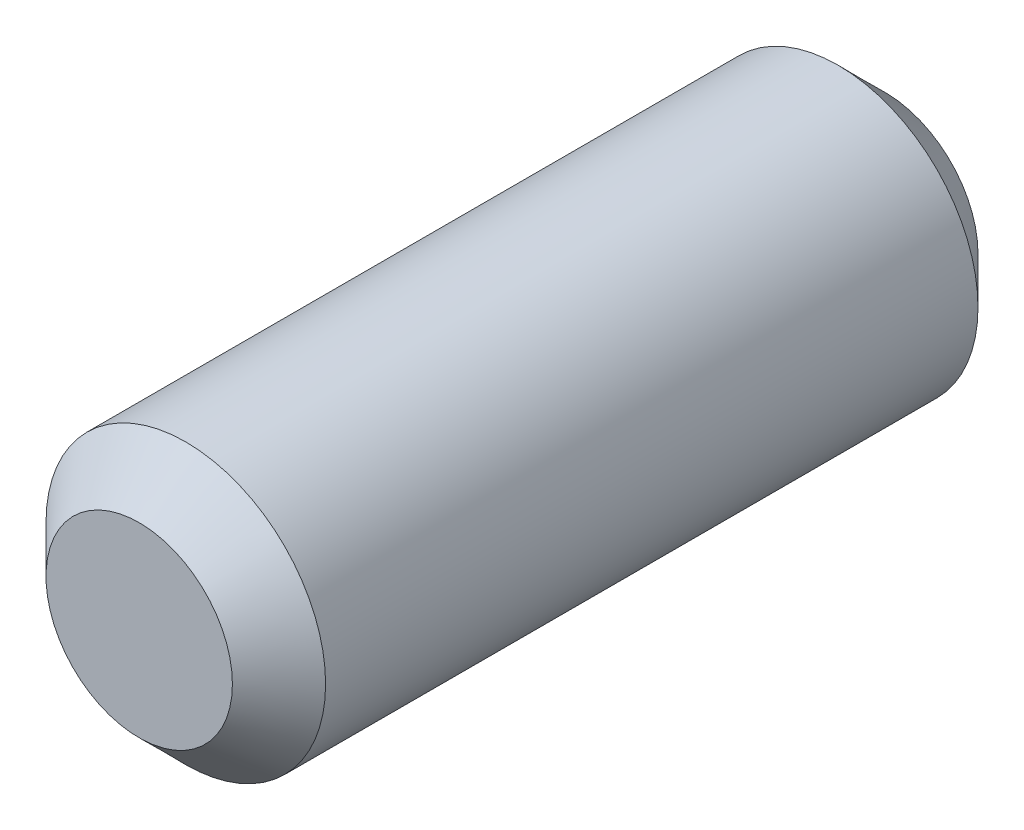
ISO-10303-21;
HEADER;
FILE_DESCRIPTION(('STEP AP214'),'2;1');
FILE_NAME('part.step','',(''),(''),'','','');
FILE_SCHEMA(('AUTOMOTIVE_DESIGN { 1 0 10303 214 1 1 1 1 }'));
ENDSEC;
DATA;
#1=APPLICATION_CONTEXT('core data for automotive mechanical design processes');
#2=APPLICATION_PROTOCOL_DEFINITION('international standard','automotive_design',2000,#1);
#3=PRODUCT_CONTEXT('',#1,'mechanical');
#4=PRODUCT('Part','Part','',(#3));
#5=PRODUCT_RELATED_PRODUCT_CATEGORY('part','',(#4));
#6=PRODUCT_DEFINITION_FORMATION('','',#4);
#7=PRODUCT_DEFINITION_CONTEXT('part definition',#1,'design');
#8=PRODUCT_DEFINITION('design','',#6,#7);
#9=PRODUCT_DEFINITION_SHAPE('','',#8);
#10=(LENGTH_UNIT() NAMED_UNIT(*) SI_UNIT(.MILLI.,.METRE.));
#11=(NAMED_UNIT(*) PLANE_ANGLE_UNIT() SI_UNIT($,.RADIAN.));
#12=(NAMED_UNIT(*) SI_UNIT($,.STERADIAN.) SOLID_ANGLE_UNIT());
#13=UNCERTAINTY_MEASURE_WITH_UNIT(LENGTH_MEASURE(1.E-05),#10,'distance_accuracy_value','');
#14=(GEOMETRIC_REPRESENTATION_CONTEXT(3) GLOBAL_UNCERTAINTY_ASSIGNED_CONTEXT((#13)) GLOBAL_UNIT_ASSIGNED_CONTEXT((#10,
#11,#12)) REPRESENTATION_CONTEXT('',''));
#15=CARTESIAN_POINT('',(0.,0.,0.));
#16=DIRECTION('',(0.,0.,1.));
#17=DIRECTION('',(1.,0.,0.));
#18=AXIS2_PLACEMENT_3D('',#15,#16,#17);
#19=CARTESIAN_POINT('',(0.,0.,8.));
#20=DIRECTION('',(0.,0.,-1.));
#21=DIRECTION('',(-1.,0.,0.));
#22=AXIS2_PLACEMENT_3D('',#19,#20,#21);
#23=CYLINDRICAL_SURFACE('',#22,1.5);
#24=CARTESIAN_POINT('',(0.,0.,0.500000000000001));
#25=DIRECTION('',(0.,0.,1.));
#26=DIRECTION('',(1.,0.,0.));
#27=AXIS2_PLACEMENT_3D('',#24,#25,#26);
#28=CIRCLE('',#27,1.5);
#29=CARTESIAN_POINT('',(1.5,0.,0.500000000000001));
#30=VERTEX_POINT('',#29);
#31=EDGE_CURVE('E53',#30,#30,#28,.T.);
#32=ORIENTED_EDGE('',*,*,#31,.T.);
#33=EDGE_LOOP('',(#32));
#34=FACE_BOUND('',#33,.T.);
#35=CARTESIAN_POINT('',(0.,0.,7.5));
#36=DIRECTION('',(0.,0.,1.));
#37=DIRECTION('',(1.,0.,0.));
#38=AXIS2_PLACEMENT_3D('',#35,#36,#37);
#39=CIRCLE('',#38,1.5);
#40=CARTESIAN_POINT('',(1.5,0.,7.5));
#41=VERTEX_POINT('',#40);
#42=EDGE_CURVE('E58',#41,#41,#39,.F.);
#43=ORIENTED_EDGE('',*,*,#42,.T.);
#44=EDGE_LOOP('',(#43));
#45=FACE_BOUND('',#44,.T.);
#46=ADVANCED_FACE('F39',(#34,#45),#23,.T.);
#47=CARTESIAN_POINT('',(0.,0.,8.));
#48=DIRECTION('',(0.,0.,1.));
#49=DIRECTION('',(1.,0.,0.));
#50=AXIS2_PLACEMENT_3D('',#47,#48,#49);
#51=PLANE('',#50);
#52=CARTESIAN_POINT('',(0.,0.,8.));
#53=DIRECTION('',(0.,0.,1.));
#54=DIRECTION('',(1.,0.,0.));
#55=AXIS2_PLACEMENT_3D('',#52,#53,#54);
#56=CIRCLE('',#55,0.999999999999999);
#57=CARTESIAN_POINT('',(0.999999999999999,0.,8.));
#58=VERTEX_POINT('',#57);
#59=EDGE_CURVE('E10',#58,#58,#56,.T.);
#60=ORIENTED_EDGE('',*,*,#59,.T.);
#61=EDGE_LOOP('',(#60));
#62=FACE_BOUND('',#61,.T.);
#63=ADVANCED_FACE('F75',(#62),#51,.T.);
#64=CARTESIAN_POINT('',(0.,0.,0.));
#65=DIRECTION('',(0.,0.,1.));
#66=DIRECTION('',(1.,0.,0.));
#67=AXIS2_PLACEMENT_3D('',#64,#65,#66);
#68=PLANE('',#67);
#69=CARTESIAN_POINT('',(0.,0.,0.));
#70=DIRECTION('',(0.,0.,1.));
#71=DIRECTION('',(1.,0.,0.));
#72=AXIS2_PLACEMENT_3D('',#69,#70,#71);
#73=CIRCLE('',#72,0.999999999999997);
#74=CARTESIAN_POINT('',(0.999999999999997,0.,0.));
#75=VERTEX_POINT('',#74);
#76=EDGE_CURVE('E48',#75,#75,#73,.F.);
#77=ORIENTED_EDGE('',*,*,#76,.T.);
#78=EDGE_LOOP('',(#77));
#79=FACE_BOUND('',#78,.T.);
#80=ADVANCED_FACE('F72',(#79),#68,.F.);
#81=CARTESIAN_POINT('',(0.,0.,0.500000000000001));
#82=DIRECTION('',(0.,0.,1.));
#83=DIRECTION('',(1.,0.,0.));
#84=AXIS2_PLACEMENT_3D('',#81,#82,#83);
#85=CONICAL_SURFACE('',#84,1.5,0.78539816339745);
#86=ORIENTED_EDGE('',*,*,#76,.F.);
#87=EDGE_LOOP('',(#86));
#88=FACE_BOUND('',#87,.T.);
#89=ORIENTED_EDGE('',*,*,#31,.F.);
#90=EDGE_LOOP('',(#89));
#91=FACE_BOUND('',#90,.T.);
#92=ADVANCED_FACE('F68',(#88,#91),#85,.T.);
#93=CARTESIAN_POINT('',(0.,0.,8.));
#94=DIRECTION('',(0.,0.,-1.));
#95=DIRECTION('',(-1.,0.,0.));
#96=AXIS2_PLACEMENT_3D('',#93,#94,#95);
#97=CONICAL_SURFACE('',#96,0.999999999999999,0.785398163397447);
#98=ORIENTED_EDGE('',*,*,#42,.F.);
#99=EDGE_LOOP('',(#98));
#100=FACE_BOUND('',#99,.T.);
#101=ORIENTED_EDGE('',*,*,#59,.F.);
#102=EDGE_LOOP('',(#101));
#103=FACE_BOUND('',#102,.T.);
#104=ADVANCED_FACE('F42',(#100,#103),#97,.T.);
#105=CLOSED_SHELL('',(#46,#63,#80,#92,#104));
#106=MANIFOLD_SOLID_BREP('B2',#105);
#107=ADVANCED_BREP_SHAPE_REPRESENTATION('',(#18,#106),#14);
#108=SHAPE_DEFINITION_REPRESENTATION(#9,#107);
ENDSEC;
END-ISO-10303-21;
